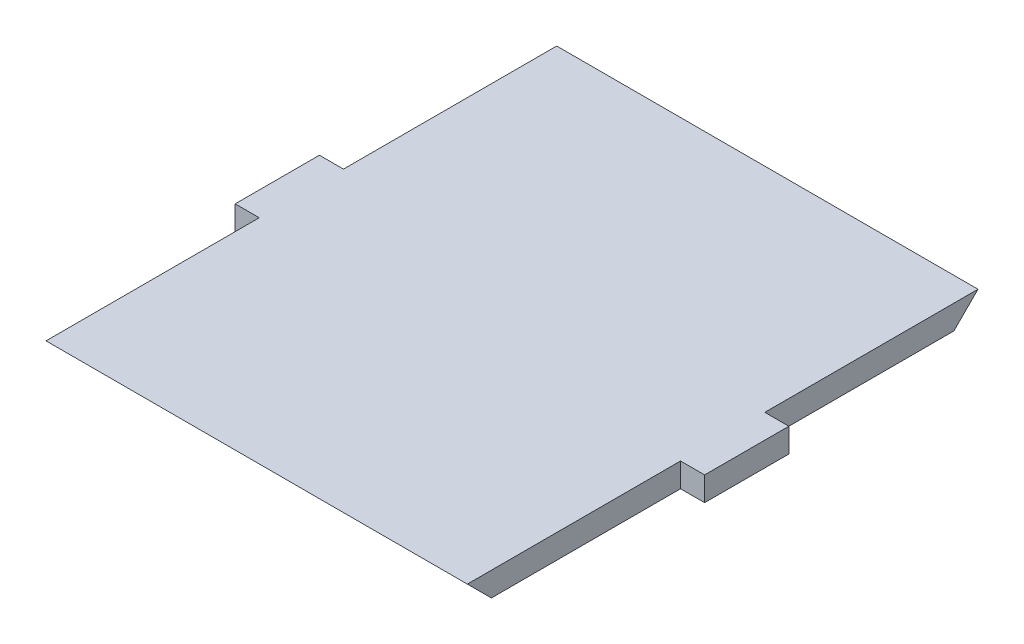
ISO-10303-21;
HEADER;
FILE_DESCRIPTION(('STEP AP214'),'2;1');
FILE_NAME('part.step','',(''),(''),'','','');
FILE_SCHEMA(('AUTOMOTIVE_DESIGN { 1 0 10303 214 1 1 1 1 }'));
ENDSEC;
DATA;
#1=APPLICATION_CONTEXT('core data for automotive mechanical design processes');
#2=APPLICATION_PROTOCOL_DEFINITION('international standard','automotive_design',2000,#1);
#3=PRODUCT_CONTEXT('',#1,'mechanical');
#4=PRODUCT('Part','Part','',(#3));
#5=PRODUCT_RELATED_PRODUCT_CATEGORY('part','',(#4));
#6=PRODUCT_DEFINITION_FORMATION('','',#4);
#7=PRODUCT_DEFINITION_CONTEXT('part definition',#1,'design');
#8=PRODUCT_DEFINITION('design','',#6,#7);
#9=PRODUCT_DEFINITION_SHAPE('','',#8);
#10=(LENGTH_UNIT() NAMED_UNIT(*) SI_UNIT(.MILLI.,.METRE.));
#11=(NAMED_UNIT(*) PLANE_ANGLE_UNIT() SI_UNIT($,.RADIAN.));
#12=(NAMED_UNIT(*) SI_UNIT($,.STERADIAN.) SOLID_ANGLE_UNIT());
#13=UNCERTAINTY_MEASURE_WITH_UNIT(LENGTH_MEASURE(1.E-05),#10,'distance_accuracy_value','');
#14=(GEOMETRIC_REPRESENTATION_CONTEXT(3) GLOBAL_UNCERTAINTY_ASSIGNED_CONTEXT((#13)) GLOBAL_UNIT_ASSIGNED_CONTEXT((#10,
#11,#12)) REPRESENTATION_CONTEXT('',''));
#15=CARTESIAN_POINT('',(0.,0.,0.));
#16=DIRECTION('',(0.,0.,1.));
#17=DIRECTION('',(1.,0.,0.));
#18=AXIS2_PLACEMENT_3D('',#15,#16,#17);
#19=CARTESIAN_POINT('',(0.,2.,-4.0977418483686));
#20=DIRECTION('',(0.,0.,1.));
#21=DIRECTION('',(1.,0.,0.));
#22=AXIS2_PLACEMENT_3D('',#19,#20,#21);
#23=PLANE('',#22);
#24=DIRECTION('',(-1.,0.,0.));
#25=VECTOR('',#24,1.);
#26=CARTESIAN_POINT('',(0.,0.,-4.0977418483686));
#27=LINE('',#26,#25);
#28=CARTESIAN_POINT('',(-6.40030462543466,0.,-4.0977418483686));
#29=VERTEX_POINT('',#28);
#30=CARTESIAN_POINT('',(-8.40030462543466,0.,-4.0977418483686));
#31=VERTEX_POINT('',#30);
#32=EDGE_CURVE('E168',#29,#31,#27,.T.);
#33=ORIENTED_EDGE('',*,*,#32,.T.);
#34=DIRECTION('',(0.,-1.,0.));
#35=VECTOR('',#34,1.);
#36=CARTESIAN_POINT('',(-8.40030462543466,2.,-4.0977418483686));
#37=LINE('',#36,#35);
#38=CARTESIAN_POINT('',(-8.40030462543466,2.,-4.0977418483686));
#39=VERTEX_POINT('',#38);
#40=EDGE_CURVE('E226',#39,#31,#37,.T.);
#41=ORIENTED_EDGE('',*,*,#40,.F.);
#42=DIRECTION('',(-1.,0.,0.));
#43=VECTOR('',#42,1.);
#44=CARTESIAN_POINT('',(0.,2.,-4.0977418483686));
#45=LINE('',#44,#43);
#46=CARTESIAN_POINT('',(-6.40030462543466,2.,-4.0977418483686));
#47=VERTEX_POINT('',#46);
#48=EDGE_CURVE('E164',#47,#39,#45,.T.);
#49=ORIENTED_EDGE('',*,*,#48,.F.);
#50=DIRECTION('',(0.,-1.,0.));
#51=VECTOR('',#50,1.);
#52=CARTESIAN_POINT('',(-6.40030462543466,2.,-4.0977418483686));
#53=LINE('',#52,#51);
#54=EDGE_CURVE('E213',#47,#29,#53,.T.);
#55=ORIENTED_EDGE('',*,*,#54,.T.);
#56=EDGE_LOOP('',(#33,#41,#49,#55));
#57=FACE_BOUND('',#56,.T.);
#58=ADVANCED_FACE('F34',(#57),#23,.F.);
#59=CARTESIAN_POINT('',(-8.40030462543466,2.,0.));
#60=DIRECTION('',(1.,0.,0.));
#61=DIRECTION('',(0.,0.,-1.));
#62=AXIS2_PLACEMENT_3D('',#59,#60,#61);
#63=PLANE('',#62);
#64=DIRECTION('',(0.,0.,1.));
#65=VECTOR('',#64,1.);
#66=CARTESIAN_POINT('',(-8.40030462543466,0.,0.));
#67=LINE('',#66,#65);
#68=CARTESIAN_POINT('',(-8.40030462543465,0.,2.9022581516314));
#69=VERTEX_POINT('',#68);
#70=EDGE_CURVE('E193',#31,#69,#67,.T.);
#71=ORIENTED_EDGE('',*,*,#70,.T.);
#72=DIRECTION('',(0.,-1.,0.));
#73=VECTOR('',#72,1.);
#74=CARTESIAN_POINT('',(-8.40030462543465,2.,2.9022581516314));
#75=LINE('',#74,#73);
#76=CARTESIAN_POINT('',(-8.40030462543465,2.,2.9022581516314));
#77=VERTEX_POINT('',#76);
#78=EDGE_CURVE('E224',#77,#69,#75,.T.);
#79=ORIENTED_EDGE('',*,*,#78,.F.);
#80=DIRECTION('',(0.,0.,1.));
#81=VECTOR('',#80,1.);
#82=CARTESIAN_POINT('',(-8.40030462543466,2.,0.));
#83=LINE('',#82,#81);
#84=EDGE_CURVE('E162',#39,#77,#83,.T.);
#85=ORIENTED_EDGE('',*,*,#84,.F.);
#86=ORIENTED_EDGE('',*,*,#40,.T.);
#87=EDGE_LOOP('',(#71,#79,#85,#86));
#88=FACE_BOUND('',#87,.T.);
#89=ADVANCED_FACE('F249',(#88),#63,.F.);
#90=CARTESIAN_POINT('',(0.,2.,2.9022581516314));
#91=DIRECTION('',(0.,0.,1.));
#92=DIRECTION('',(1.,0.,0.));
#93=AXIS2_PLACEMENT_3D('',#90,#91,#92);
#94=PLANE('',#93);
#95=DIRECTION('',(-1.,0.,0.));
#96=VECTOR('',#95,1.);
#97=CARTESIAN_POINT('',(0.,0.,2.9022581516314));
#98=LINE('',#97,#96);
#99=CARTESIAN_POINT('',(-6.40030462543466,0.,2.9022581516314));
#100=VERTEX_POINT('',#99);
#101=EDGE_CURVE('E187',#100,#69,#98,.T.);
#102=ORIENTED_EDGE('',*,*,#101,.F.);
#103=DIRECTION('',(0.,-1.,0.));
#104=VECTOR('',#103,1.);
#105=CARTESIAN_POINT('',(-6.40030462543466,2.,2.9022581516314));
#106=LINE('',#105,#104);
#107=CARTESIAN_POINT('',(-6.40030462543466,2.,2.9022581516314));
#108=VERTEX_POINT('',#107);
#109=EDGE_CURVE('E222',#108,#100,#106,.T.);
#110=ORIENTED_EDGE('',*,*,#109,.F.);
#111=DIRECTION('',(-1.,0.,0.));
#112=VECTOR('',#111,1.);
#113=CARTESIAN_POINT('',(0.,2.,2.9022581516314));
#114=LINE('',#113,#112);
#115=EDGE_CURVE('E157',#108,#77,#114,.T.);
#116=ORIENTED_EDGE('',*,*,#115,.T.);
#117=ORIENTED_EDGE('',*,*,#78,.T.);
#118=EDGE_LOOP('',(#102,#110,#116,#117));
#119=FACE_BOUND('',#118,.T.);
#120=ADVANCED_FACE('F254',(#119),#94,.T.);
#121=CARTESIAN_POINT('',(-6.40030462543466,2.,0.));
#122=DIRECTION('',(1.,0.,0.));
#123=DIRECTION('',(0.,0.,-1.));
#124=AXIS2_PLACEMENT_3D('',#121,#122,#123);
#125=PLANE('',#124);
#126=DIRECTION('',(0.,0.,1.));
#127=VECTOR('',#126,1.);
#128=CARTESIAN_POINT('',(-6.40030462543466,0.,0.));
#129=LINE('',#128,#127);
#130=CARTESIAN_POINT('',(-6.40030462543466,0.,18.6172581516314));
#131=VERTEX_POINT('',#130);
#132=EDGE_CURVE('E181',#100,#131,#129,.T.);
#133=ORIENTED_EDGE('',*,*,#132,.T.);
#134=DIRECTION('',(0.,0.707106781186544,0.707106781186552));
#135=VECTOR('',#134,1.);
#136=CARTESIAN_POINT('',(-6.40030462543466,-8.3086290758157,10.3086290758156));
#137=LINE('',#136,#135);
#138=CARTESIAN_POINT('',(-6.40030462543466,2.,20.6172581516314));
#139=VERTEX_POINT('',#138);
#140=EDGE_CURVE('E55',#131,#139,#137,.T.);
#141=ORIENTED_EDGE('',*,*,#140,.T.);
#142=DIRECTION('',(0.,0.,1.));
#143=VECTOR('',#142,1.);
#144=CARTESIAN_POINT('',(-6.40030462543466,2.,0.));
#145=LINE('',#144,#143);
#146=EDGE_CURVE('E155',#108,#139,#145,.T.);
#147=ORIENTED_EDGE('',*,*,#146,.F.);
#148=ORIENTED_EDGE('',*,*,#109,.T.);
#149=EDGE_LOOP('',(#133,#141,#147,#148));
#150=FACE_BOUND('',#149,.T.);
#151=ADVANCED_FACE('F245',(#150),#125,.F.);
#152=CARTESIAN_POINT('',(28.5996953745653,2.,0.));
#153=DIRECTION('',(1.,0.,0.));
#154=DIRECTION('',(0.,0.,-1.));
#155=AXIS2_PLACEMENT_3D('',#152,#153,#154);
#156=PLANE('',#155);
#157=DIRECTION('',(0.,0.707106781186544,0.707106781186552));
#158=VECTOR('',#157,1.);
#159=CARTESIAN_POINT('',(28.5996953745653,2.,20.6172581516314));
#160=LINE('',#159,#158);
#161=CARTESIAN_POINT('',(28.5996953745653,0.,18.6172581516314));
#162=VERTEX_POINT('',#161);
#163=CARTESIAN_POINT('',(28.5996953745653,2.,20.6172581516314));
#164=VERTEX_POINT('',#163);
#165=EDGE_CURVE('E169',#162,#164,#160,.T.);
#166=ORIENTED_EDGE('',*,*,#165,.F.);
#167=DIRECTION('',(0.,0.,1.));
#168=VECTOR('',#167,1.);
#169=CARTESIAN_POINT('',(28.5996953745653,0.,0.));
#170=LINE('',#169,#168);
#171=CARTESIAN_POINT('',(28.5996953745653,0.,2.90225815163139));
#172=VERTEX_POINT('',#171);
#173=EDGE_CURVE('E184',#172,#162,#170,.T.);
#174=ORIENTED_EDGE('',*,*,#173,.F.);
#175=DIRECTION('',(0.,-1.,0.));
#176=VECTOR('',#175,1.);
#177=CARTESIAN_POINT('',(28.5996953745653,2.,2.90225815163139));
#178=LINE('',#177,#176);
#179=CARTESIAN_POINT('',(28.5996953745653,2.,2.90225815163139));
#180=VERTEX_POINT('',#179);
#181=EDGE_CURVE('E220',#180,#172,#178,.T.);
#182=ORIENTED_EDGE('',*,*,#181,.F.);
#183=DIRECTION('',(0.,0.,1.));
#184=VECTOR('',#183,1.);
#185=CARTESIAN_POINT('',(28.5996953745653,2.,0.));
#186=LINE('',#185,#184);
#187=EDGE_CURVE('E143',#180,#164,#186,.T.);
#188=ORIENTED_EDGE('',*,*,#187,.T.);
#189=EDGE_LOOP('',(#166,#174,#182,#188));
#190=FACE_BOUND('',#189,.T.);
#191=ADVANCED_FACE('F231',(#190),#156,.T.);
#192=CARTESIAN_POINT('',(0.,2.,2.90225815163139));
#193=DIRECTION('',(0.,0.,-1.));
#194=DIRECTION('',(-1.,0.,0.));
#195=AXIS2_PLACEMENT_3D('',#192,#193,#194);
#196=PLANE('',#195);
#197=DIRECTION('',(1.,0.,0.));
#198=VECTOR('',#197,1.);
#199=CARTESIAN_POINT('',(0.,0.,2.90225815163139));
#200=LINE('',#199,#198);
#201=CARTESIAN_POINT('',(30.5996953745653,0.,2.90225815163139));
#202=VERTEX_POINT('',#201);
#203=EDGE_CURVE('E191',#172,#202,#200,.T.);
#204=ORIENTED_EDGE('',*,*,#203,.T.);
#205=DIRECTION('',(0.,-1.,0.));
#206=VECTOR('',#205,1.);
#207=CARTESIAN_POINT('',(30.5996953745653,2.,2.90225815163139));
#208=LINE('',#207,#206);
#209=CARTESIAN_POINT('',(30.5996953745653,2.,2.90225815163139));
#210=VERTEX_POINT('',#209);
#211=EDGE_CURVE('E204',#210,#202,#208,.T.);
#212=ORIENTED_EDGE('',*,*,#211,.F.);
#213=DIRECTION('',(1.,0.,0.));
#214=VECTOR('',#213,1.);
#215=CARTESIAN_POINT('',(0.,2.,2.90225815163139));
#216=LINE('',#215,#214);
#217=EDGE_CURVE('E149',#180,#210,#216,.T.);
#218=ORIENTED_EDGE('',*,*,#217,.F.);
#219=ORIENTED_EDGE('',*,*,#181,.T.);
#220=EDGE_LOOP('',(#204,#212,#218,#219));
#221=FACE_BOUND('',#220,.T.);
#222=ADVANCED_FACE('F233',(#221),#196,.F.);
#223=CARTESIAN_POINT('',(30.5996953745653,2.,0.));
#224=DIRECTION('',(1.,0.,0.));
#225=DIRECTION('',(0.,0.,-1.));
#226=AXIS2_PLACEMENT_3D('',#223,#224,#225);
#227=PLANE('',#226);
#228=DIRECTION('',(0.,0.,1.));
#229=VECTOR('',#228,1.);
#230=CARTESIAN_POINT('',(30.5996953745653,0.,0.));
#231=LINE('',#230,#229);
#232=CARTESIAN_POINT('',(30.5996953745653,0.,-4.09774184836861));
#233=VERTEX_POINT('',#232);
#234=EDGE_CURVE('E235',#233,#202,#231,.T.);
#235=ORIENTED_EDGE('',*,*,#234,.F.);
#236=DIRECTION('',(0.,-1.,0.));
#237=VECTOR('',#236,1.);
#238=CARTESIAN_POINT('',(30.5996953745653,2.,-4.09774184836861));
#239=LINE('',#238,#237);
#240=CARTESIAN_POINT('',(30.5996953745653,2.,-4.09774184836861));
#241=VERTEX_POINT('',#240);
#242=EDGE_CURVE('E206',#241,#233,#239,.T.);
#243=ORIENTED_EDGE('',*,*,#242,.F.);
#244=DIRECTION('',(0.,0.,1.));
#245=VECTOR('',#244,1.);
#246=CARTESIAN_POINT('',(30.5996953745653,2.,0.));
#247=LINE('',#246,#245);
#248=EDGE_CURVE('E144',#241,#210,#247,.T.);
#249=ORIENTED_EDGE('',*,*,#248,.T.);
#250=ORIENTED_EDGE('',*,*,#211,.T.);
#251=EDGE_LOOP('',(#235,#243,#249,#250));
#252=FACE_BOUND('',#251,.T.);
#253=ADVANCED_FACE('F202',(#252),#227,.T.);
#254=CARTESIAN_POINT('',(0.,2.,-4.0977418483686));
#255=DIRECTION('',(0.,0.,-1.));
#256=DIRECTION('',(-1.,0.,0.));
#257=AXIS2_PLACEMENT_3D('',#254,#255,#256);
#258=PLANE('',#257);
#259=DIRECTION('',(1.,0.,0.));
#260=VECTOR('',#259,1.);
#261=CARTESIAN_POINT('',(0.,0.,-4.0977418483686));
#262=LINE('',#261,#260);
#263=CARTESIAN_POINT('',(28.5996953745653,0.,-4.09774184836861));
#264=VERTEX_POINT('',#263);
#265=EDGE_CURVE('E182',#264,#233,#262,.T.);
#266=ORIENTED_EDGE('',*,*,#265,.F.);
#267=DIRECTION('',(0.,-1.,0.));
#268=VECTOR('',#267,1.);
#269=CARTESIAN_POINT('',(28.5996953745653,2.,-4.09774184836861));
#270=LINE('',#269,#268);
#271=CARTESIAN_POINT('',(28.5996953745653,2.,-4.09774184836861));
#272=VERTEX_POINT('',#271);
#273=EDGE_CURVE('E211',#272,#264,#270,.T.);
#274=ORIENTED_EDGE('',*,*,#273,.F.);
#275=DIRECTION('',(1.,0.,0.));
#276=VECTOR('',#275,1.);
#277=CARTESIAN_POINT('',(0.,2.,-4.0977418483686));
#278=LINE('',#277,#276);
#279=EDGE_CURVE('E141',#272,#241,#278,.T.);
#280=ORIENTED_EDGE('',*,*,#279,.T.);
#281=ORIENTED_EDGE('',*,*,#242,.T.);
#282=EDGE_LOOP('',(#266,#274,#280,#281));
#283=FACE_BOUND('',#282,.T.);
#284=ADVANCED_FACE('F210',(#283),#258,.T.);
#285=DIRECTION('',(0.,-0.707106781186543,0.707106781186552));
#286=VECTOR('',#285,1.);
#287=CARTESIAN_POINT('',(28.5996953745653,0.,-19.8091487183686));
#288=LINE('',#287,#286);
#289=CARTESIAN_POINT('',(28.5996953745653,2.,-21.8091487183686));
#290=VERTEX_POINT('',#289);
#291=CARTESIAN_POINT('',(28.5996953745653,0.,-19.8091487183686));
#292=VERTEX_POINT('',#291);
#293=EDGE_CURVE('E48',#290,#292,#288,.T.);
#294=ORIENTED_EDGE('',*,*,#293,.F.);
#295=EDGE_CURVE('E127',#290,#272,#186,.T.);
#296=ORIENTED_EDGE('',*,*,#295,.T.);
#297=ORIENTED_EDGE('',*,*,#273,.T.);
#298=EDGE_CURVE('E134',#292,#264,#170,.T.);
#299=ORIENTED_EDGE('',*,*,#298,.F.);
#300=EDGE_LOOP('',(#294,#296,#297,#299));
#301=FACE_BOUND('',#300,.T.);
#302=ADVANCED_FACE('F132',(#301),#156,.T.);
#303=CARTESIAN_POINT('',(-6.40030462543466,2.,-21.8091487183686));
#304=VERTEX_POINT('',#303);
#305=EDGE_CURVE('E126',#304,#47,#145,.T.);
#306=ORIENTED_EDGE('',*,*,#305,.F.);
#307=DIRECTION('',(0.,-0.707106781186543,0.707106781186552));
#308=VECTOR('',#307,1.);
#309=CARTESIAN_POINT('',(-6.40030462543466,-8.90457435918431,-10.9045743591842));
#310=LINE('',#309,#308);
#311=CARTESIAN_POINT('',(-6.40030462543466,0.,-19.8091487183686));
#312=VERTEX_POINT('',#311);
#313=EDGE_CURVE('E122',#304,#312,#310,.T.);
#314=ORIENTED_EDGE('',*,*,#313,.T.);
#315=EDGE_CURVE('E166',#312,#29,#129,.T.);
#316=ORIENTED_EDGE('',*,*,#315,.T.);
#317=ORIENTED_EDGE('',*,*,#54,.F.);
#318=EDGE_LOOP('',(#306,#314,#316,#317));
#319=FACE_BOUND('',#318,.T.);
#320=ADVANCED_FACE('F173',(#319),#125,.F.);
#321=CARTESIAN_POINT('',(0.,2.,0.));
#322=DIRECTION('',(0.,1.,0.));
#323=DIRECTION('',(0.,0.,1.));
#324=AXIS2_PLACEMENT_3D('',#321,#322,#323);
#325=PLANE('',#324);
#326=ORIENTED_EDGE('',*,*,#48,.T.);
#327=ORIENTED_EDGE('',*,*,#84,.T.);
#328=ORIENTED_EDGE('',*,*,#115,.F.);
#329=ORIENTED_EDGE('',*,*,#146,.T.);
#330=DIRECTION('',(1.,0.,0.));
#331=VECTOR('',#330,1.);
#332=CARTESIAN_POINT('',(0.,2.,20.6172581516314));
#333=LINE('',#332,#331);
#334=EDGE_CURVE('E150',#139,#164,#333,.T.);
#335=ORIENTED_EDGE('',*,*,#334,.T.);
#336=ORIENTED_EDGE('',*,*,#187,.F.);
#337=ORIENTED_EDGE('',*,*,#217,.T.);
#338=ORIENTED_EDGE('',*,*,#248,.F.);
#339=ORIENTED_EDGE('',*,*,#279,.F.);
#340=ORIENTED_EDGE('',*,*,#295,.F.);
#341=DIRECTION('',(1.,0.,0.));
#342=VECTOR('',#341,1.);
#343=CARTESIAN_POINT('',(0.,2.,-21.8091487183686));
#344=LINE('',#343,#342);
#345=EDGE_CURVE('E119',#304,#290,#344,.T.);
#346=ORIENTED_EDGE('',*,*,#345,.F.);
#347=ORIENTED_EDGE('',*,*,#305,.T.);
#348=EDGE_LOOP('',(#326,#327,#328,#329,#335,#336,#337,#338,#339,#340,#346,#347));
#349=FACE_BOUND('',#348,.T.);
#350=ADVANCED_FACE('F138',(#349),#325,.T.);
#351=CARTESIAN_POINT('',(0.,0.,0.));
#352=DIRECTION('',(0.,1.,0.));
#353=DIRECTION('',(0.,0.,1.));
#354=AXIS2_PLACEMENT_3D('',#351,#352,#353);
#355=PLANE('',#354);
#356=ORIENTED_EDGE('',*,*,#315,.F.);
#357=DIRECTION('',(1.,0.,0.));
#358=VECTOR('',#357,1.);
#359=CARTESIAN_POINT('',(0.,0.,-19.8091487183686));
#360=LINE('',#359,#358);
#361=EDGE_CURVE('E11',#312,#292,#360,.T.);
#362=ORIENTED_EDGE('',*,*,#361,.T.);
#363=ORIENTED_EDGE('',*,*,#298,.T.);
#364=ORIENTED_EDGE('',*,*,#265,.T.);
#365=ORIENTED_EDGE('',*,*,#234,.T.);
#366=ORIENTED_EDGE('',*,*,#203,.F.);
#367=ORIENTED_EDGE('',*,*,#173,.T.);
#368=DIRECTION('',(-1.,0.,0.));
#369=VECTOR('',#368,1.);
#370=CARTESIAN_POINT('',(0.,0.,18.6172581516314));
#371=LINE('',#370,#369);
#372=EDGE_CURVE('E41',#162,#131,#371,.T.);
#373=ORIENTED_EDGE('',*,*,#372,.T.);
#374=ORIENTED_EDGE('',*,*,#132,.F.);
#375=ORIENTED_EDGE('',*,*,#101,.T.);
#376=ORIENTED_EDGE('',*,*,#70,.F.);
#377=ORIENTED_EDGE('',*,*,#32,.F.);
#378=EDGE_LOOP('',(#356,#362,#363,#364,#365,#366,#367,#373,#374,#375,#376,#377));
#379=FACE_BOUND('',#378,.T.);
#380=ADVANCED_FACE('F178',(#379),#355,.F.);
#381=CARTESIAN_POINT('',(-8.40030462543466,2.,20.6172581516314));
#382=DIRECTION('',(0.,0.707106781186551,-0.707106781186543));
#383=DIRECTION('',(0.,0.707106781186544,0.707106781186552));
#384=AXIS2_PLACEMENT_3D('',#381,#382,#383);
#385=PLANE('',#384);
#386=ORIENTED_EDGE('',*,*,#372,.F.);
#387=ORIENTED_EDGE('',*,*,#165,.T.);
#388=ORIENTED_EDGE('',*,*,#334,.F.);
#389=ORIENTED_EDGE('',*,*,#140,.F.);
#390=EDGE_LOOP('',(#386,#387,#388,#389));
#391=FACE_BOUND('',#390,.T.);
#392=ADVANCED_FACE('F230',(#391),#385,.F.);
#393=CARTESIAN_POINT('',(-8.40030462543466,0.,-19.8091487183686));
#394=DIRECTION('',(0.,0.707106781186552,0.707106781186543));
#395=DIRECTION('',(0.,-0.707106781186543,0.707106781186552));
#396=AXIS2_PLACEMENT_3D('',#393,#394,#395);
#397=PLANE('',#396);
#398=ORIENTED_EDGE('',*,*,#345,.T.);
#399=ORIENTED_EDGE('',*,*,#293,.T.);
#400=ORIENTED_EDGE('',*,*,#361,.F.);
#401=ORIENTED_EDGE('',*,*,#313,.F.);
#402=EDGE_LOOP('',(#398,#399,#400,#401));
#403=FACE_BOUND('',#402,.T.);
#404=ADVANCED_FACE('F120',(#403),#397,.F.);
#405=CLOSED_SHELL('',(#58,#89,#120,#151,#191,#222,#253,#284,#302,#320,#350,#380,#392,#404));
#406=MANIFOLD_SOLID_BREP('B2',#405);
#407=ADVANCED_BREP_SHAPE_REPRESENTATION('',(#18,#406),#14);
#408=SHAPE_DEFINITION_REPRESENTATION(#9,#407);
ENDSEC;
END-ISO-10303-21;
